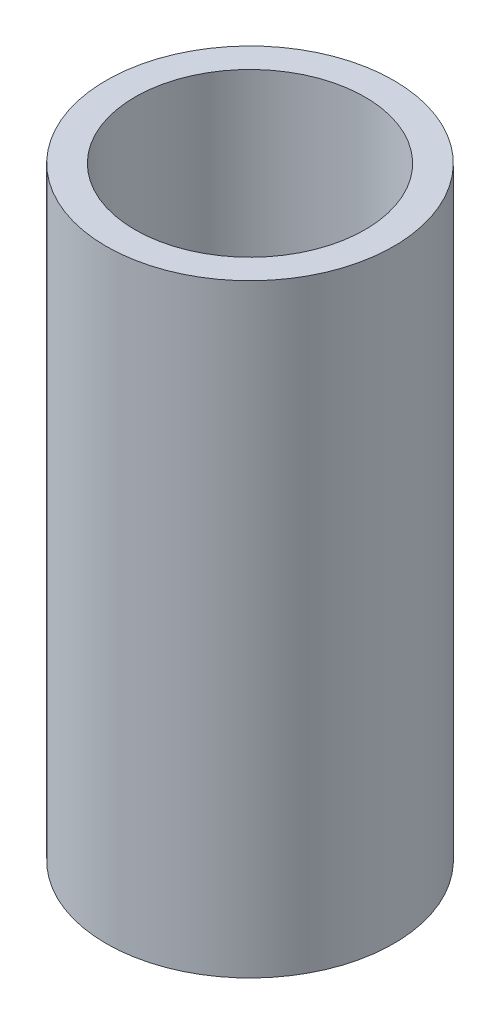
ISO-10303-21;
HEADER;
FILE_DESCRIPTION(('STEP AP214'),'2;1');
FILE_NAME('part.step','',(''),(''),'','','');
FILE_SCHEMA(('AUTOMOTIVE_DESIGN { 1 0 10303 214 1 1 1 1 }'));
ENDSEC;
DATA;
#1=APPLICATION_CONTEXT('core data for automotive mechanical design processes');
#2=APPLICATION_PROTOCOL_DEFINITION('international standard','automotive_design',2000,#1);
#3=PRODUCT_CONTEXT('',#1,'mechanical');
#4=PRODUCT('Part','Part','',(#3));
#5=PRODUCT_RELATED_PRODUCT_CATEGORY('part','',(#4));
#6=PRODUCT_DEFINITION_FORMATION('','',#4);
#7=PRODUCT_DEFINITION_CONTEXT('part definition',#1,'design');
#8=PRODUCT_DEFINITION('design','',#6,#7);
#9=PRODUCT_DEFINITION_SHAPE('','',#8);
#10=(LENGTH_UNIT() NAMED_UNIT(*) SI_UNIT(.MILLI.,.METRE.));
#11=(NAMED_UNIT(*) PLANE_ANGLE_UNIT() SI_UNIT($,.RADIAN.));
#12=(NAMED_UNIT(*) SI_UNIT($,.STERADIAN.) SOLID_ANGLE_UNIT());
#13=UNCERTAINTY_MEASURE_WITH_UNIT(LENGTH_MEASURE(1.E-05),#10,'distance_accuracy_value','');
#14=(GEOMETRIC_REPRESENTATION_CONTEXT(3) GLOBAL_UNCERTAINTY_ASSIGNED_CONTEXT((#13)) GLOBAL_UNIT_ASSIGNED_CONTEXT((#10,
#11,#12)) REPRESENTATION_CONTEXT('',''));
#15=CARTESIAN_POINT('',(0.,0.,0.));
#16=DIRECTION('',(0.,0.,1.));
#17=DIRECTION('',(1.,0.,0.));
#18=AXIS2_PLACEMENT_3D('',#15,#16,#17);
#19=CARTESIAN_POINT('',(5.0035,0.003499999999974,5.0035));
#20=DIRECTION('',(0.,1.,0.));
#21=DIRECTION('',(0.,0.,1.));
#22=AXIS2_PLACEMENT_3D('',#19,#20,#21);
#23=CYLINDRICAL_SURFACE('',#22,4.);
#24=CARTESIAN_POINT('',(5.0035,0.003499999999974,5.0035));
#25=DIRECTION('',(0.,1.,0.));
#26=DIRECTION('',(0.,0.,1.));
#27=AXIS2_PLACEMENT_3D('',#24,#25,#26);
#28=CIRCLE('',#27,4.);
#29=CARTESIAN_POINT('',(5.0035,0.003499999999974,9.0035));
#30=VERTEX_POINT('',#29);
#31=EDGE_CURVE('E25',#30,#30,#28,.F.);
#32=ORIENTED_EDGE('',*,*,#31,.T.);
#33=EDGE_LOOP('',(#32));
#34=FACE_BOUND('',#33,.T.);
#35=CARTESIAN_POINT('',(5.0035,21.0035,5.0035));
#36=DIRECTION('',(0.,1.,0.));
#37=DIRECTION('',(0.,0.,1.));
#38=AXIS2_PLACEMENT_3D('',#35,#36,#37);
#39=CIRCLE('',#38,4.);
#40=CARTESIAN_POINT('',(5.0035,21.0035,9.0035));
#41=VERTEX_POINT('',#40);
#42=EDGE_CURVE('E16',#41,#41,#39,.F.);
#43=ORIENTED_EDGE('',*,*,#42,.F.);
#44=EDGE_LOOP('',(#43));
#45=FACE_BOUND('',#44,.T.);
#46=ADVANCED_FACE('F13',(#34,#45),#23,.F.);
#47=CARTESIAN_POINT('',(5.0035,21.0035,5.0035));
#48=DIRECTION('',(0.,1.,0.));
#49=DIRECTION('',(0.,0.,1.));
#50=AXIS2_PLACEMENT_3D('',#47,#48,#49);
#51=PLANE('',#50);
#52=ORIENTED_EDGE('',*,*,#42,.T.);
#53=EDGE_LOOP('',(#52));
#54=FACE_BOUND('',#53,.T.);
#55=CARTESIAN_POINT('',(5.0035,21.0035,5.0035));
#56=DIRECTION('',(0.,1.,0.));
#57=DIRECTION('',(0.,0.,1.));
#58=AXIS2_PLACEMENT_3D('',#55,#56,#57);
#59=CIRCLE('',#58,5.);
#60=CARTESIAN_POINT('',(5.0035,21.0035,10.0035));
#61=VERTEX_POINT('',#60);
#62=EDGE_CURVE('E20',#61,#61,#59,.F.);
#63=ORIENTED_EDGE('',*,*,#62,.F.);
#64=EDGE_LOOP('',(#63));
#65=FACE_BOUND('',#64,.T.);
#66=ADVANCED_FACE('F33',(#54,#65),#51,.T.);
#67=CARTESIAN_POINT('',(5.0035,0.003499999999974,5.0035));
#68=DIRECTION('',(0.,1.,0.));
#69=DIRECTION('',(0.,0.,1.));
#70=AXIS2_PLACEMENT_3D('',#67,#68,#69);
#71=PLANE('',#70);
#72=ORIENTED_EDGE('',*,*,#31,.F.);
#73=EDGE_LOOP('',(#72));
#74=FACE_BOUND('',#73,.T.);
#75=CARTESIAN_POINT('',(5.0035,0.003499999999974,5.0035));
#76=DIRECTION('',(0.,1.,0.));
#77=DIRECTION('',(0.,0.,1.));
#78=AXIS2_PLACEMENT_3D('',#75,#76,#77);
#79=CIRCLE('',#78,5.);
#80=CARTESIAN_POINT('',(5.0035,0.003499999999974,10.0035));
#81=VERTEX_POINT('',#80);
#82=EDGE_CURVE('E8',#81,#81,#79,.T.);
#83=ORIENTED_EDGE('',*,*,#82,.F.);
#84=EDGE_LOOP('',(#83));
#85=FACE_BOUND('',#84,.T.);
#86=ADVANCED_FACE('F41',(#74,#85),#71,.F.);
#87=CARTESIAN_POINT('',(5.0035,0.003499999999974,5.0035));
#88=DIRECTION('',(0.,1.,0.));
#89=DIRECTION('',(0.,0.,1.));
#90=AXIS2_PLACEMENT_3D('',#87,#88,#89);
#91=CYLINDRICAL_SURFACE('',#90,5.);
#92=ORIENTED_EDGE('',*,*,#82,.T.);
#93=EDGE_LOOP('',(#92));
#94=FACE_BOUND('',#93,.T.);
#95=ORIENTED_EDGE('',*,*,#62,.T.);
#96=EDGE_LOOP('',(#95));
#97=FACE_BOUND('',#96,.T.);
#98=ADVANCED_FACE('F42',(#94,#97),#91,.T.);
#99=CLOSED_SHELL('',(#46,#66,#86,#98));
#100=MANIFOLD_SOLID_BREP('B1',#99);
#101=ADVANCED_BREP_SHAPE_REPRESENTATION('',(#18,#100),#14);
#102=SHAPE_DEFINITION_REPRESENTATION(#9,#101);
ENDSEC;
END-ISO-10303-21;
